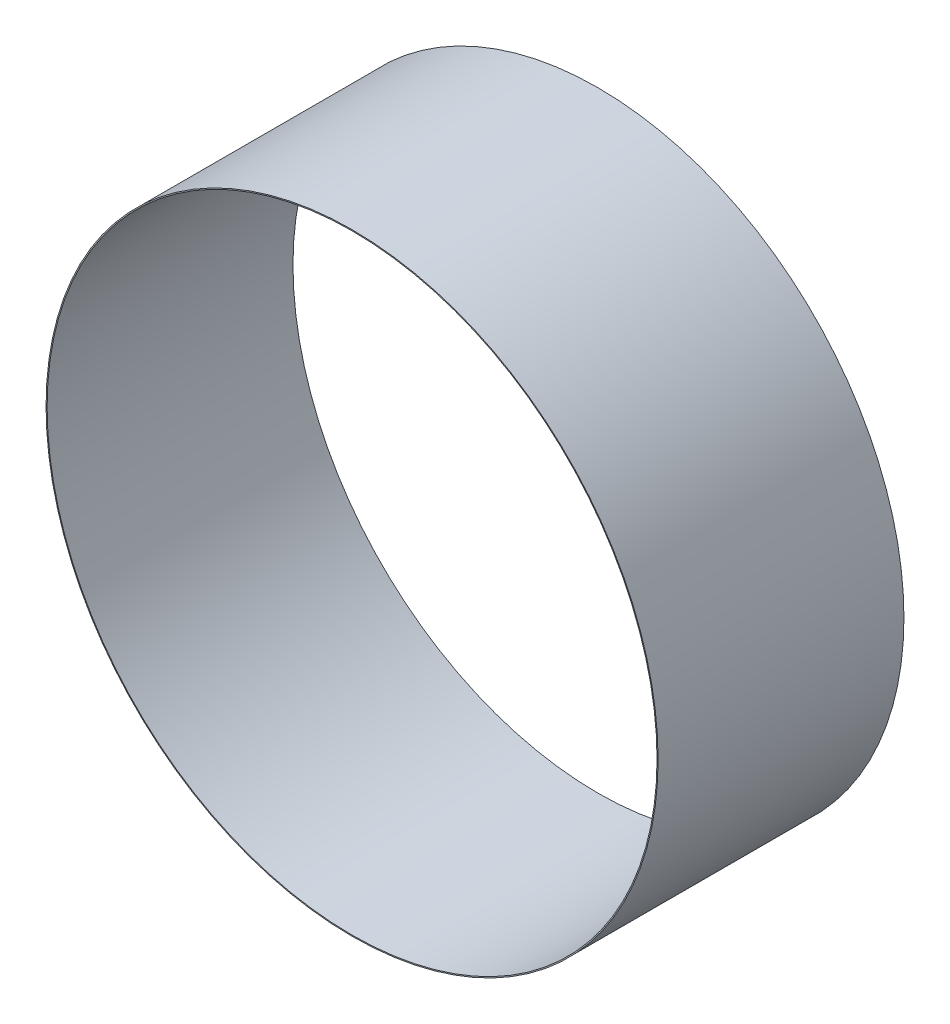
ISO-10303-21;
HEADER;
FILE_DESCRIPTION(('STEP AP214'),'2;1');
FILE_NAME('part.step','',(''),(''),'','','');
FILE_SCHEMA(('AUTOMOTIVE_DESIGN { 1 0 10303 214 1 1 1 1 }'));
ENDSEC;
DATA;
#1=APPLICATION_CONTEXT('core data for automotive mechanical design processes');
#2=APPLICATION_PROTOCOL_DEFINITION('international standard','automotive_design',2000,#1);
#3=PRODUCT_CONTEXT('',#1,'mechanical');
#4=PRODUCT('Part','Part','',(#3));
#5=PRODUCT_RELATED_PRODUCT_CATEGORY('part','',(#4));
#6=PRODUCT_DEFINITION_FORMATION('','',#4);
#7=PRODUCT_DEFINITION_CONTEXT('part definition',#1,'design');
#8=PRODUCT_DEFINITION('design','',#6,#7);
#9=PRODUCT_DEFINITION_SHAPE('','',#8);
#10=(LENGTH_UNIT() NAMED_UNIT(*) SI_UNIT(.MILLI.,.METRE.));
#11=(NAMED_UNIT(*) PLANE_ANGLE_UNIT() SI_UNIT($,.RADIAN.));
#12=(NAMED_UNIT(*) SI_UNIT($,.STERADIAN.) SOLID_ANGLE_UNIT());
#13=UNCERTAINTY_MEASURE_WITH_UNIT(LENGTH_MEASURE(1.E-05),#10,'distance_accuracy_value','');
#14=(GEOMETRIC_REPRESENTATION_CONTEXT(3) GLOBAL_UNCERTAINTY_ASSIGNED_CONTEXT((#13)) GLOBAL_UNIT_ASSIGNED_CONTEXT((#10,
#11,#12)) REPRESENTATION_CONTEXT('',''));
#15=CARTESIAN_POINT('',(0.,0.,0.));
#16=DIRECTION('',(0.,0.,1.));
#17=DIRECTION('',(1.,0.,0.));
#18=AXIS2_PLACEMENT_3D('',#15,#16,#17);
#19=CARTESIAN_POINT('',(0.,0.,49.));
#20=DIRECTION('',(0.,0.,1.));
#21=DIRECTION('',(1.,0.,0.));
#22=AXIS2_PLACEMENT_3D('',#19,#20,#21);
#23=PLANE('',#22);
#24=CARTESIAN_POINT('',(0.,0.,49.));
#25=DIRECTION('',(0.,0.,1.));
#26=DIRECTION('',(1.,0.,0.));
#27=AXIS2_PLACEMENT_3D('',#24,#25,#26);
#28=CIRCLE('',#27,60.9907873534478);
#29=CARTESIAN_POINT('',(60.9907873534478,0.,49.));
#30=VERTEX_POINT('',#29);
#31=EDGE_CURVE('E10',#30,#30,#28,.T.);
#32=ORIENTED_EDGE('',*,*,#31,.T.);
#33=EDGE_LOOP('',(#32));
#34=FACE_BOUND('',#33,.T.);
#35=CARTESIAN_POINT('',(0.,0.,49.));
#36=DIRECTION('',(0.,0.,1.));
#37=DIRECTION('',(1.,0.,0.));
#38=AXIS2_PLACEMENT_3D('',#35,#36,#37);
#39=CIRCLE('',#38,60.7800066025941);
#40=CARTESIAN_POINT('',(60.7800066025941,0.,49.));
#41=VERTEX_POINT('',#40);
#42=EDGE_CURVE('E45',#41,#41,#39,.T.);
#43=ORIENTED_EDGE('',*,*,#42,.F.);
#44=EDGE_LOOP('',(#43));
#45=FACE_BOUND('',#44,.T.);
#46=ADVANCED_FACE('F34',(#34,#45),#23,.T.);
#47=CARTESIAN_POINT('',(0.,0.,0.));
#48=DIRECTION('',(0.,0.,1.));
#49=DIRECTION('',(1.,0.,0.));
#50=AXIS2_PLACEMENT_3D('',#47,#48,#49);
#51=PLANE('',#50);
#52=CARTESIAN_POINT('',(0.,0.,0.));
#53=DIRECTION('',(0.,0.,1.));
#54=DIRECTION('',(1.,0.,0.));
#55=AXIS2_PLACEMENT_3D('',#52,#53,#54);
#56=CIRCLE('',#55,60.9907873534478);
#57=CARTESIAN_POINT('',(60.9907873534478,0.,0.));
#58=VERTEX_POINT('',#57);
#59=EDGE_CURVE('E38',#58,#58,#56,.T.);
#60=ORIENTED_EDGE('',*,*,#59,.F.);
#61=EDGE_LOOP('',(#60));
#62=FACE_BOUND('',#61,.T.);
#63=CARTESIAN_POINT('',(0.,0.,0.));
#64=DIRECTION('',(0.,0.,1.));
#65=DIRECTION('',(1.,0.,0.));
#66=AXIS2_PLACEMENT_3D('',#63,#64,#65);
#67=CIRCLE('',#66,60.7800066025941);
#68=CARTESIAN_POINT('',(60.7800066025941,0.,0.));
#69=VERTEX_POINT('',#68);
#70=EDGE_CURVE('E47',#69,#69,#67,.T.);
#71=ORIENTED_EDGE('',*,*,#70,.T.);
#72=EDGE_LOOP('',(#71));
#73=FACE_BOUND('',#72,.T.);
#74=ADVANCED_FACE('F57',(#62,#73),#51,.F.);
#75=CARTESIAN_POINT('',(0.,0.,49.));
#76=DIRECTION('',(0.,0.,-1.));
#77=DIRECTION('',(-1.,0.,0.));
#78=AXIS2_PLACEMENT_3D('',#75,#76,#77);
#79=CYLINDRICAL_SURFACE('',#78,60.9907873534478);
#80=ORIENTED_EDGE('',*,*,#31,.F.);
#81=EDGE_LOOP('',(#80));
#82=FACE_BOUND('',#81,.T.);
#83=ORIENTED_EDGE('',*,*,#59,.T.);
#84=EDGE_LOOP('',(#83));
#85=FACE_BOUND('',#84,.T.);
#86=ADVANCED_FACE('F36',(#82,#85),#79,.T.);
#87=CARTESIAN_POINT('',(0.,0.,49.));
#88=DIRECTION('',(0.,0.,-1.));
#89=DIRECTION('',(-1.,0.,0.));
#90=AXIS2_PLACEMENT_3D('',#87,#88,#89);
#91=CYLINDRICAL_SURFACE('',#90,60.7800066025941);
#92=ORIENTED_EDGE('',*,*,#42,.T.);
#93=EDGE_LOOP('',(#92));
#94=FACE_BOUND('',#93,.T.);
#95=ORIENTED_EDGE('',*,*,#70,.F.);
#96=EDGE_LOOP('',(#95));
#97=FACE_BOUND('',#96,.T.);
#98=ADVANCED_FACE('F53',(#94,#97),#91,.F.);
#99=CLOSED_SHELL('',(#46,#74,#86,#98));
#100=MANIFOLD_SOLID_BREP('B2',#99);
#101=ADVANCED_BREP_SHAPE_REPRESENTATION('',(#18,#100),#14);
#102=SHAPE_DEFINITION_REPRESENTATION(#9,#101);
ENDSEC;
END-ISO-10303-21;
